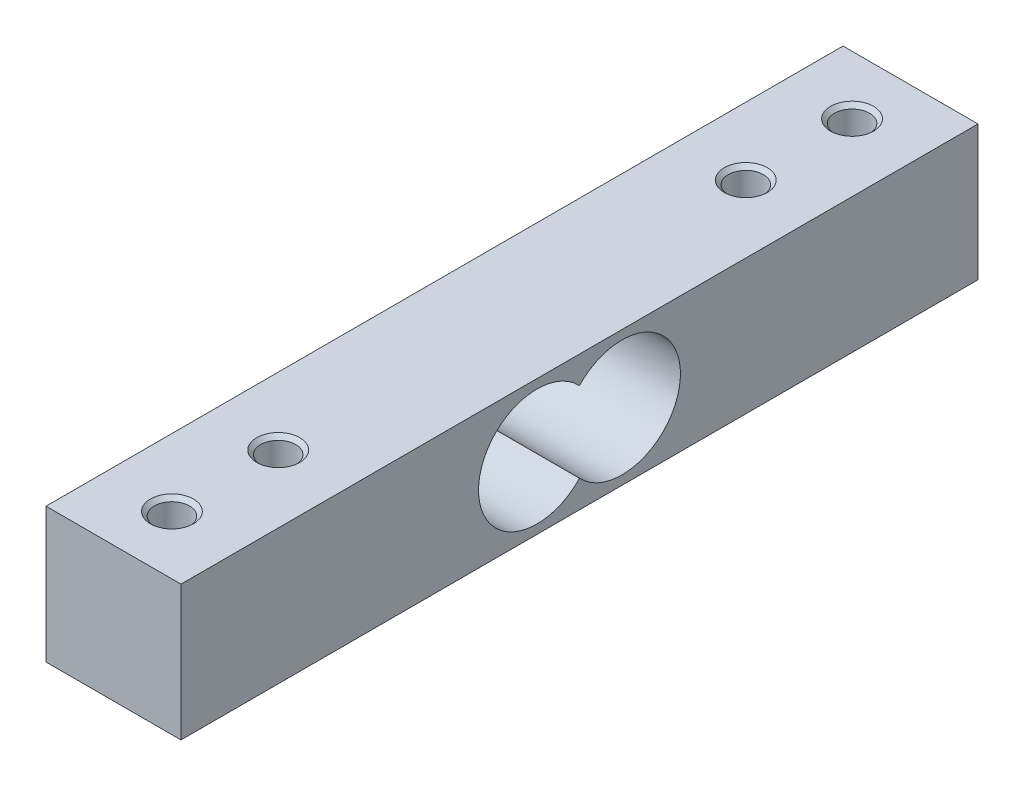
ISO-10303-21;
HEADER;
FILE_DESCRIPTION(('STEP AP214'),'2;1');
FILE_NAME('part.step','',(''),(''),'','','');
FILE_SCHEMA(('AUTOMOTIVE_DESIGN { 1 0 10303 214 1 1 1 1 }'));
ENDSEC;
DATA;
#1=APPLICATION_CONTEXT('core data for automotive mechanical design processes');
#2=APPLICATION_PROTOCOL_DEFINITION('international standard','automotive_design',2000,#1);
#3=PRODUCT_CONTEXT('',#1,'mechanical');
#4=PRODUCT('Part','Part','',(#3));
#5=PRODUCT_RELATED_PRODUCT_CATEGORY('part','',(#4));
#6=PRODUCT_DEFINITION_FORMATION('','',#4);
#7=PRODUCT_DEFINITION_CONTEXT('part definition',#1,'design');
#8=PRODUCT_DEFINITION('design','',#6,#7);
#9=PRODUCT_DEFINITION_SHAPE('','',#8);
#10=(LENGTH_UNIT() NAMED_UNIT(*) SI_UNIT(.MILLI.,.METRE.));
#11=(NAMED_UNIT(*) PLANE_ANGLE_UNIT() SI_UNIT($,.RADIAN.));
#12=(NAMED_UNIT(*) SI_UNIT($,.STERADIAN.) SOLID_ANGLE_UNIT());
#13=UNCERTAINTY_MEASURE_WITH_UNIT(LENGTH_MEASURE(1.E-05),#10,'distance_accuracy_value','');
#14=(GEOMETRIC_REPRESENTATION_CONTEXT(3) GLOBAL_UNCERTAINTY_ASSIGNED_CONTEXT((#13)) GLOBAL_UNIT_ASSIGNED_CONTEXT((#10,
#11,#12)) REPRESENTATION_CONTEXT('',''));
#15=CARTESIAN_POINT('',(0.,0.,0.));
#16=DIRECTION('',(0.,0.,1.));
#17=DIRECTION('',(1.,0.,0.));
#18=AXIS2_PLACEMENT_3D('',#15,#16,#17);
#19=CARTESIAN_POINT('',(6.35,6.35,-75.));
#20=DIRECTION('',(1.,0.,0.));
#21=DIRECTION('',(0.,1.,0.));
#22=AXIS2_PLACEMENT_3D('',#19,#20,#21);
#23=PLANE('',#22);
#24=CARTESIAN_POINT('',(6.35,0.,-33.5));
#25=DIRECTION('',(1.,0.,0.));
#26=DIRECTION('',(0.,-1.,0.));
#27=AXIS2_PLACEMENT_3D('',#24,#25,#26);
#28=CIRCLE('',#27,5.5);
#29=CARTESIAN_POINT('',(6.35,3.77491721763537,-37.5));
#30=VERTEX_POINT('',#29);
#31=CARTESIAN_POINT('',(6.35,-3.77491721763537,-37.5));
#32=VERTEX_POINT('',#31);
#33=EDGE_CURVE('E60',#30,#32,#28,.T.);
#34=ORIENTED_EDGE('',*,*,#33,.F.);
#35=CARTESIAN_POINT('',(6.35,0.,-41.5));
#36=DIRECTION('',(1.,0.,0.));
#37=DIRECTION('',(0.,1.,0.));
#38=AXIS2_PLACEMENT_3D('',#35,#36,#37);
#39=CIRCLE('',#38,5.5);
#40=EDGE_CURVE('E111',#32,#30,#39,.T.);
#41=ORIENTED_EDGE('',*,*,#40,.F.);
#42=EDGE_LOOP('',(#34,#41));
#43=FACE_BOUND('',#42,.T.);
#44=DIRECTION('',(0.,1.,0.));
#45=VECTOR('',#44,1.);
#46=CARTESIAN_POINT('',(6.35,6.35,0.));
#47=LINE('',#46,#45);
#48=CARTESIAN_POINT('',(6.35,-6.35,0.));
#49=VERTEX_POINT('',#48);
#50=CARTESIAN_POINT('',(6.35,6.35,0.));
#51=VERTEX_POINT('',#50);
#52=EDGE_CURVE('E122',#49,#51,#47,.T.);
#53=ORIENTED_EDGE('',*,*,#52,.F.);
#54=DIRECTION('',(0.,0.,1.));
#55=VECTOR('',#54,1.);
#56=CARTESIAN_POINT('',(6.35,-6.35,-75.));
#57=LINE('',#56,#55);
#58=CARTESIAN_POINT('',(6.35,-6.35,-75.));
#59=VERTEX_POINT('',#58);
#60=EDGE_CURVE('E11',#59,#49,#57,.T.);
#61=ORIENTED_EDGE('',*,*,#60,.F.);
#62=DIRECTION('',(0.,1.,0.));
#63=VECTOR('',#62,1.);
#64=CARTESIAN_POINT('',(6.35,6.35,-75.));
#65=LINE('',#64,#63);
#66=CARTESIAN_POINT('',(6.35,6.35,-75.));
#67=VERTEX_POINT('',#66);
#68=EDGE_CURVE('E124',#59,#67,#65,.T.);
#69=ORIENTED_EDGE('',*,*,#68,.T.);
#70=DIRECTION('',(0.,0.,1.));
#71=VECTOR('',#70,1.);
#72=CARTESIAN_POINT('',(6.35,6.35,-75.));
#73=LINE('',#72,#71);
#74=EDGE_CURVE('E46',#67,#51,#73,.T.);
#75=ORIENTED_EDGE('',*,*,#74,.T.);
#76=EDGE_LOOP('',(#53,#61,#69,#75));
#77=FACE_BOUND('',#76,.T.);
#78=ADVANCED_FACE('F43',(#43,#77),#23,.T.);
#79=CARTESIAN_POINT('',(-6.35,-6.35,-75.));
#80=DIRECTION('',(0.,-1.,0.));
#81=DIRECTION('',(0.,0.,-1.));
#82=AXIS2_PLACEMENT_3D('',#79,#80,#81);
#83=PLANE('',#82);
#84=CARTESIAN_POINT('',(0.,-6.35,-5.5));
#85=DIRECTION('',(0.,1.,0.));
#86=DIRECTION('',(0.,0.,1.));
#87=AXIS2_PLACEMENT_3D('',#84,#85,#86);
#88=CIRCLE('',#87,1.65);
#89=CARTESIAN_POINT('',(0.,-6.35,-3.85));
#90=VERTEX_POINT('',#89);
#91=EDGE_CURVE('E353',#90,#90,#88,.T.);
#92=ORIENTED_EDGE('',*,*,#91,.T.);
#93=EDGE_LOOP('',(#92));
#94=FACE_BOUND('',#93,.T.);
#95=CARTESIAN_POINT('',(0.,-6.35,-15.5));
#96=DIRECTION('',(0.,1.,0.));
#97=DIRECTION('',(0.,0.,1.));
#98=AXIS2_PLACEMENT_3D('',#95,#96,#97);
#99=CIRCLE('',#98,1.65);
#100=CARTESIAN_POINT('',(0.,-6.35,-13.85));
#101=VERTEX_POINT('',#100);
#102=EDGE_CURVE('E367',#101,#101,#99,.T.);
#103=ORIENTED_EDGE('',*,*,#102,.T.);
#104=EDGE_LOOP('',(#103));
#105=FACE_BOUND('',#104,.T.);
#106=CARTESIAN_POINT('',(0.,-6.35,-59.5));
#107=DIRECTION('',(0.,1.,0.));
#108=DIRECTION('',(0.,0.,1.));
#109=AXIS2_PLACEMENT_3D('',#106,#107,#108);
#110=CIRCLE('',#109,1.65);
#111=CARTESIAN_POINT('',(0.,-6.35,-57.85));
#112=VERTEX_POINT('',#111);
#113=EDGE_CURVE('E379',#112,#112,#110,.T.);
#114=ORIENTED_EDGE('',*,*,#113,.T.);
#115=EDGE_LOOP('',(#114));
#116=FACE_BOUND('',#115,.T.);
#117=CARTESIAN_POINT('',(0.,-6.35,-69.5));
#118=DIRECTION('',(0.,1.,0.));
#119=DIRECTION('',(0.,0.,1.));
#120=AXIS2_PLACEMENT_3D('',#117,#118,#119);
#121=CIRCLE('',#120,1.65);
#122=CARTESIAN_POINT('',(0.,-6.35,-67.85));
#123=VERTEX_POINT('',#122);
#124=EDGE_CURVE('E116',#123,#123,#121,.T.);
#125=ORIENTED_EDGE('',*,*,#124,.T.);
#126=EDGE_LOOP('',(#125));
#127=FACE_BOUND('',#126,.T.);
#128=DIRECTION('',(1.,0.,0.));
#129=VECTOR('',#128,1.);
#130=CARTESIAN_POINT('',(-6.35,-6.35,0.));
#131=LINE('',#130,#129);
#132=CARTESIAN_POINT('',(-6.35,-6.35,0.));
#133=VERTEX_POINT('',#132);
#134=EDGE_CURVE('E129',#133,#49,#131,.T.);
#135=ORIENTED_EDGE('',*,*,#134,.F.);
#136=DIRECTION('',(0.,0.,1.));
#137=VECTOR('',#136,1.);
#138=CARTESIAN_POINT('',(-6.35,-6.35,-75.));
#139=LINE('',#138,#137);
#140=CARTESIAN_POINT('',(-6.35,-6.35,-75.));
#141=VERTEX_POINT('',#140);
#142=EDGE_CURVE('E52',#141,#133,#139,.T.);
#143=ORIENTED_EDGE('',*,*,#142,.F.);
#144=DIRECTION('',(1.,0.,0.));
#145=VECTOR('',#144,1.);
#146=CARTESIAN_POINT('',(-6.35,-6.35,-75.));
#147=LINE('',#146,#145);
#148=EDGE_CURVE('E137',#141,#59,#147,.T.);
#149=ORIENTED_EDGE('',*,*,#148,.T.);
#150=ORIENTED_EDGE('',*,*,#60,.T.);
#151=EDGE_LOOP('',(#135,#143,#149,#150));
#152=FACE_BOUND('',#151,.T.);
#153=ADVANCED_FACE('F171',(#94,#105,#116,#127,#152),#83,.T.);
#154=CARTESIAN_POINT('',(-6.35,6.35,-75.));
#155=DIRECTION('',(-1.,0.,0.));
#156=DIRECTION('',(0.,-1.,0.));
#157=AXIS2_PLACEMENT_3D('',#154,#155,#156);
#158=PLANE('',#157);
#159=CARTESIAN_POINT('',(-6.35,0.,-33.5));
#160=DIRECTION('',(1.,0.,0.));
#161=DIRECTION('',(0.,-1.,0.));
#162=AXIS2_PLACEMENT_3D('',#159,#160,#161);
#163=CIRCLE('',#162,5.5);
#164=CARTESIAN_POINT('',(-6.35,3.77491721763537,-37.5));
#165=VERTEX_POINT('',#164);
#166=CARTESIAN_POINT('',(-6.35,-3.77491721763537,-37.5));
#167=VERTEX_POINT('',#166);
#168=EDGE_CURVE('E65',#165,#167,#163,.T.);
#169=ORIENTED_EDGE('',*,*,#168,.T.);
#170=CARTESIAN_POINT('',(-6.35,0.,-41.5));
#171=DIRECTION('',(1.,0.,0.));
#172=DIRECTION('',(0.,1.,0.));
#173=AXIS2_PLACEMENT_3D('',#170,#171,#172);
#174=CIRCLE('',#173,5.5);
#175=EDGE_CURVE('E101',#167,#165,#174,.T.);
#176=ORIENTED_EDGE('',*,*,#175,.T.);
#177=EDGE_LOOP('',(#169,#176));
#178=FACE_BOUND('',#177,.T.);
#179=DIRECTION('',(0.,-1.,0.));
#180=VECTOR('',#179,1.);
#181=CARTESIAN_POINT('',(-6.35,6.35,0.));
#182=LINE('',#181,#180);
#183=CARTESIAN_POINT('',(-6.35,6.35,0.));
#184=VERTEX_POINT('',#183);
#185=EDGE_CURVE('E148',#184,#133,#182,.T.);
#186=ORIENTED_EDGE('',*,*,#185,.F.);
#187=DIRECTION('',(0.,0.,1.));
#188=VECTOR('',#187,1.);
#189=CARTESIAN_POINT('',(-6.35,6.35,-75.));
#190=LINE('',#189,#188);
#191=CARTESIAN_POINT('',(-6.35,6.35,-75.));
#192=VERTEX_POINT('',#191);
#193=EDGE_CURVE('E156',#192,#184,#190,.T.);
#194=ORIENTED_EDGE('',*,*,#193,.F.);
#195=DIRECTION('',(0.,-1.,0.));
#196=VECTOR('',#195,1.);
#197=CARTESIAN_POINT('',(-6.35,6.35,-75.));
#198=LINE('',#197,#196);
#199=EDGE_CURVE('E133',#192,#141,#198,.T.);
#200=ORIENTED_EDGE('',*,*,#199,.T.);
#201=ORIENTED_EDGE('',*,*,#142,.T.);
#202=EDGE_LOOP('',(#186,#194,#200,#201));
#203=FACE_BOUND('',#202,.T.);
#204=ADVANCED_FACE('F108',(#178,#203),#158,.T.);
#205=CARTESIAN_POINT('',(-6.35,6.35,-75.));
#206=DIRECTION('',(0.,1.,0.));
#207=DIRECTION('',(0.,0.,1.));
#208=AXIS2_PLACEMENT_3D('',#205,#206,#207);
#209=PLANE('',#208);
#210=CARTESIAN_POINT('',(0.,6.35,-5.5));
#211=DIRECTION('',(0.,1.,0.));
#212=DIRECTION('',(0.,0.,1.));
#213=AXIS2_PLACEMENT_3D('',#210,#211,#212);
#214=CIRCLE('',#213,2.025);
#215=CARTESIAN_POINT('',(0.,6.35,-3.475));
#216=VERTEX_POINT('',#215);
#217=EDGE_CURVE('E349',#216,#216,#214,.T.);
#218=ORIENTED_EDGE('',*,*,#217,.F.);
#219=EDGE_LOOP('',(#218));
#220=FACE_BOUND('',#219,.T.);
#221=CARTESIAN_POINT('',(0.,6.35,-15.5));
#222=DIRECTION('',(0.,1.,0.));
#223=DIRECTION('',(0.,0.,1.));
#224=AXIS2_PLACEMENT_3D('',#221,#222,#223);
#225=CIRCLE('',#224,2.025);
#226=CARTESIAN_POINT('',(0.,6.35,-13.475));
#227=VERTEX_POINT('',#226);
#228=EDGE_CURVE('E359',#227,#227,#225,.T.);
#229=ORIENTED_EDGE('',*,*,#228,.F.);
#230=EDGE_LOOP('',(#229));
#231=FACE_BOUND('',#230,.T.);
#232=CARTESIAN_POINT('',(0.,6.35,-59.5));
#233=DIRECTION('',(0.,1.,0.));
#234=DIRECTION('',(0.,0.,1.));
#235=AXIS2_PLACEMENT_3D('',#232,#233,#234);
#236=CIRCLE('',#235,2.025);
#237=CARTESIAN_POINT('',(0.,6.35,-57.475));
#238=VERTEX_POINT('',#237);
#239=EDGE_CURVE('E371',#238,#238,#236,.T.);
#240=ORIENTED_EDGE('',*,*,#239,.F.);
#241=EDGE_LOOP('',(#240));
#242=FACE_BOUND('',#241,.T.);
#243=CARTESIAN_POINT('',(0.,6.35,-69.5));
#244=DIRECTION('',(0.,1.,0.));
#245=DIRECTION('',(0.,0.,1.));
#246=AXIS2_PLACEMENT_3D('',#243,#244,#245);
#247=CIRCLE('',#246,2.025);
#248=CARTESIAN_POINT('',(0.,6.35,-67.475));
#249=VERTEX_POINT('',#248);
#250=EDGE_CURVE('E383',#249,#249,#247,.T.);
#251=ORIENTED_EDGE('',*,*,#250,.F.);
#252=EDGE_LOOP('',(#251));
#253=FACE_BOUND('',#252,.T.);
#254=DIRECTION('',(-1.,0.,0.));
#255=VECTOR('',#254,1.);
#256=CARTESIAN_POINT('',(-6.35,6.35,0.));
#257=LINE('',#256,#255);
#258=EDGE_CURVE('E144',#51,#184,#257,.T.);
#259=ORIENTED_EDGE('',*,*,#258,.F.);
#260=ORIENTED_EDGE('',*,*,#74,.F.);
#261=DIRECTION('',(-1.,0.,0.));
#262=VECTOR('',#261,1.);
#263=CARTESIAN_POINT('',(-6.35,6.35,-75.));
#264=LINE('',#263,#262);
#265=EDGE_CURVE('E128',#67,#192,#264,.T.);
#266=ORIENTED_EDGE('',*,*,#265,.T.);
#267=ORIENTED_EDGE('',*,*,#193,.T.);
#268=EDGE_LOOP('',(#259,#260,#266,#267));
#269=FACE_BOUND('',#268,.T.);
#270=ADVANCED_FACE('F166',(#220,#231,#242,#253,#269),#209,.T.);
#271=CARTESIAN_POINT('',(0.,0.,-75.));
#272=DIRECTION('',(0.,0.,1.));
#273=DIRECTION('',(1.,0.,0.));
#274=AXIS2_PLACEMENT_3D('',#271,#272,#273);
#275=PLANE('',#274);
#276=ORIENTED_EDGE('',*,*,#68,.F.);
#277=ORIENTED_EDGE('',*,*,#148,.F.);
#278=ORIENTED_EDGE('',*,*,#199,.F.);
#279=ORIENTED_EDGE('',*,*,#265,.F.);
#280=EDGE_LOOP('',(#276,#277,#278,#279));
#281=FACE_BOUND('',#280,.T.);
#282=ADVANCED_FACE('F174',(#281),#275,.F.);
#283=CARTESIAN_POINT('',(0.,0.,0.));
#284=DIRECTION('',(0.,0.,1.));
#285=DIRECTION('',(1.,0.,0.));
#286=AXIS2_PLACEMENT_3D('',#283,#284,#285);
#287=PLANE('',#286);
#288=ORIENTED_EDGE('',*,*,#52,.T.);
#289=ORIENTED_EDGE('',*,*,#258,.T.);
#290=ORIENTED_EDGE('',*,*,#185,.T.);
#291=ORIENTED_EDGE('',*,*,#134,.T.);
#292=EDGE_LOOP('',(#288,#289,#290,#291));
#293=FACE_BOUND('',#292,.T.);
#294=ADVANCED_FACE('F168',(#293),#287,.T.);
#295=CARTESIAN_POINT('',(-6.35,0.,-33.5));
#296=DIRECTION('',(1.,0.,0.));
#297=DIRECTION('',(0.,1.,0.));
#298=AXIS2_PLACEMENT_3D('',#295,#296,#297);
#299=CYLINDRICAL_SURFACE('',#298,5.5);
#300=ORIENTED_EDGE('',*,*,#33,.T.);
#301=DIRECTION('',(1.,0.,0.));
#302=VECTOR('',#301,1.);
#303=CARTESIAN_POINT('',(-6.35,-3.77491721763537,-37.5));
#304=LINE('',#303,#302);
#305=EDGE_CURVE('E93',#167,#32,#304,.T.);
#306=ORIENTED_EDGE('',*,*,#305,.F.);
#307=ORIENTED_EDGE('',*,*,#168,.F.);
#308=DIRECTION('',(1.,0.,0.));
#309=VECTOR('',#308,1.);
#310=CARTESIAN_POINT('',(-6.35,3.77491721763537,-37.5));
#311=LINE('',#310,#309);
#312=EDGE_CURVE('E100',#165,#30,#311,.T.);
#313=ORIENTED_EDGE('',*,*,#312,.T.);
#314=EDGE_LOOP('',(#300,#306,#307,#313));
#315=FACE_BOUND('',#314,.T.);
#316=ADVANCED_FACE('F95',(#315),#299,.F.);
#317=CARTESIAN_POINT('',(-6.35,0.,-41.5));
#318=DIRECTION('',(1.,0.,0.));
#319=DIRECTION('',(0.,1.,0.));
#320=AXIS2_PLACEMENT_3D('',#317,#318,#319);
#321=CYLINDRICAL_SURFACE('',#320,5.5);
#322=ORIENTED_EDGE('',*,*,#40,.T.);
#323=ORIENTED_EDGE('',*,*,#312,.F.);
#324=ORIENTED_EDGE('',*,*,#175,.F.);
#325=ORIENTED_EDGE('',*,*,#305,.T.);
#326=EDGE_LOOP('',(#322,#323,#324,#325));
#327=FACE_BOUND('',#326,.T.);
#328=ADVANCED_FACE('F104',(#327),#321,.F.);
#329=CARTESIAN_POINT('',(0.,6.35,-69.5));
#330=DIRECTION('',(0.,1.,0.));
#331=DIRECTION('',(0.,0.,1.));
#332=AXIS2_PLACEMENT_3D('',#329,#330,#331);
#333=CYLINDRICAL_SURFACE('',#332,1.65);
#334=ORIENTED_EDGE('',*,*,#124,.F.);
#335=EDGE_LOOP('',(#334));
#336=FACE_BOUND('',#335,.T.);
#337=CARTESIAN_POINT('',(0.,5.975,-69.5));
#338=DIRECTION('',(0.,1.,0.));
#339=DIRECTION('',(0.,0.,1.));
#340=AXIS2_PLACEMENT_3D('',#337,#338,#339);
#341=CIRCLE('',#340,1.65);
#342=CARTESIAN_POINT('',(0.,5.975,-67.85));
#343=VERTEX_POINT('',#342);
#344=EDGE_CURVE('E386',#343,#343,#341,.T.);
#345=ORIENTED_EDGE('',*,*,#344,.T.);
#346=EDGE_LOOP('',(#345));
#347=FACE_BOUND('',#346,.T.);
#348=ADVANCED_FACE('F213',(#336,#347),#333,.F.);
#349=CARTESIAN_POINT('',(0.,6.35,-69.5));
#350=DIRECTION('',(0.,1.,0.));
#351=DIRECTION('',(0.,0.,1.));
#352=AXIS2_PLACEMENT_3D('',#349,#350,#351);
#353=CONICAL_SURFACE('',#352,2.025,0.78539816339745);
#354=ORIENTED_EDGE('',*,*,#344,.F.);
#355=EDGE_LOOP('',(#354));
#356=FACE_BOUND('',#355,.T.);
#357=ORIENTED_EDGE('',*,*,#250,.T.);
#358=EDGE_LOOP('',(#357));
#359=FACE_BOUND('',#358,.T.);
#360=ADVANCED_FACE('F219',(#356,#359),#353,.F.);
#361=CARTESIAN_POINT('',(0.,6.35,-59.5));
#362=DIRECTION('',(0.,1.,0.));
#363=DIRECTION('',(0.,0.,1.));
#364=AXIS2_PLACEMENT_3D('',#361,#362,#363);
#365=CYLINDRICAL_SURFACE('',#364,1.65);
#366=ORIENTED_EDGE('',*,*,#113,.F.);
#367=EDGE_LOOP('',(#366));
#368=FACE_BOUND('',#367,.T.);
#369=CARTESIAN_POINT('',(0.,5.975,-59.5));
#370=DIRECTION('',(0.,1.,0.));
#371=DIRECTION('',(0.,0.,1.));
#372=AXIS2_PLACEMENT_3D('',#369,#370,#371);
#373=CIRCLE('',#372,1.65);
#374=CARTESIAN_POINT('',(0.,5.975,-57.85));
#375=VERTEX_POINT('',#374);
#376=EDGE_CURVE('E375',#375,#375,#373,.T.);
#377=ORIENTED_EDGE('',*,*,#376,.T.);
#378=EDGE_LOOP('',(#377));
#379=FACE_BOUND('',#378,.T.);
#380=ADVANCED_FACE('F232',(#368,#379),#365,.F.);
#381=CARTESIAN_POINT('',(0.,6.35,-59.5));
#382=DIRECTION('',(0.,1.,0.));
#383=DIRECTION('',(0.,0.,1.));
#384=AXIS2_PLACEMENT_3D('',#381,#382,#383);
#385=CONICAL_SURFACE('',#384,2.025,0.78539816339745);
#386=ORIENTED_EDGE('',*,*,#376,.F.);
#387=EDGE_LOOP('',(#386));
#388=FACE_BOUND('',#387,.T.);
#389=ORIENTED_EDGE('',*,*,#239,.T.);
#390=EDGE_LOOP('',(#389));
#391=FACE_BOUND('',#390,.T.);
#392=ADVANCED_FACE('F243',(#388,#391),#385,.F.);
#393=CARTESIAN_POINT('',(0.,6.35,-15.5));
#394=DIRECTION('',(0.,1.,0.));
#395=DIRECTION('',(0.,0.,1.));
#396=AXIS2_PLACEMENT_3D('',#393,#394,#395);
#397=CYLINDRICAL_SURFACE('',#396,1.65);
#398=ORIENTED_EDGE('',*,*,#102,.F.);
#399=EDGE_LOOP('',(#398));
#400=FACE_BOUND('',#399,.T.);
#401=CARTESIAN_POINT('',(0.,5.975,-15.5));
#402=DIRECTION('',(0.,1.,0.));
#403=DIRECTION('',(0.,0.,1.));
#404=AXIS2_PLACEMENT_3D('',#401,#402,#403);
#405=CIRCLE('',#404,1.65);
#406=CARTESIAN_POINT('',(0.,5.975,-13.85));
#407=VERTEX_POINT('',#406);
#408=EDGE_CURVE('E363',#407,#407,#405,.T.);
#409=ORIENTED_EDGE('',*,*,#408,.T.);
#410=EDGE_LOOP('',(#409));
#411=FACE_BOUND('',#410,.T.);
#412=ADVANCED_FACE('F255',(#400,#411),#397,.F.);
#413=CARTESIAN_POINT('',(0.,6.35,-15.5));
#414=DIRECTION('',(0.,1.,0.));
#415=DIRECTION('',(0.,0.,1.));
#416=AXIS2_PLACEMENT_3D('',#413,#414,#415);
#417=CONICAL_SURFACE('',#416,2.025,0.78539816339745);
#418=ORIENTED_EDGE('',*,*,#408,.F.);
#419=EDGE_LOOP('',(#418));
#420=FACE_BOUND('',#419,.T.);
#421=ORIENTED_EDGE('',*,*,#228,.T.);
#422=EDGE_LOOP('',(#421));
#423=FACE_BOUND('',#422,.T.);
#424=ADVANCED_FACE('F266',(#420,#423),#417,.F.);
#425=CARTESIAN_POINT('',(0.,6.35,-5.5));
#426=DIRECTION('',(0.,1.,0.));
#427=DIRECTION('',(0.,0.,1.));
#428=AXIS2_PLACEMENT_3D('',#425,#426,#427);
#429=CYLINDRICAL_SURFACE('',#428,1.65);
#430=ORIENTED_EDGE('',*,*,#91,.F.);
#431=EDGE_LOOP('',(#430));
#432=FACE_BOUND('',#431,.T.);
#433=CARTESIAN_POINT('',(0.,5.975,-5.5));
#434=DIRECTION('',(0.,1.,0.));
#435=DIRECTION('',(0.,0.,1.));
#436=AXIS2_PLACEMENT_3D('',#433,#434,#435);
#437=CIRCLE('',#436,1.65);
#438=CARTESIAN_POINT('',(0.,5.975,-3.85));
#439=VERTEX_POINT('',#438);
#440=EDGE_CURVE('E346',#439,#439,#437,.T.);
#441=ORIENTED_EDGE('',*,*,#440,.T.);
#442=EDGE_LOOP('',(#441));
#443=FACE_BOUND('',#442,.T.);
#444=ADVANCED_FACE('F278',(#432,#443),#429,.F.);
#445=CARTESIAN_POINT('',(0.,6.35,-5.5));
#446=DIRECTION('',(0.,1.,0.));
#447=DIRECTION('',(0.,0.,1.));
#448=AXIS2_PLACEMENT_3D('',#445,#446,#447);
#449=CONICAL_SURFACE('',#448,2.025,0.78539816339745);
#450=ORIENTED_EDGE('',*,*,#440,.F.);
#451=EDGE_LOOP('',(#450));
#452=FACE_BOUND('',#451,.T.);
#453=ORIENTED_EDGE('',*,*,#217,.T.);
#454=EDGE_LOOP('',(#453));
#455=FACE_BOUND('',#454,.T.);
#456=ADVANCED_FACE('F289',(#452,#455),#449,.F.);
#457=CLOSED_SHELL('',(#78,#153,#204,#270,#282,#294,#316,#328,#348,#360,#380,#392,#412,#424,#444,#456));
#458=MANIFOLD_SOLID_BREP('B2',#457);
#459=ADVANCED_BREP_SHAPE_REPRESENTATION('',(#18,#458),#14);
#460=SHAPE_DEFINITION_REPRESENTATION(#9,#459);
ENDSEC;
END-ISO-10303-21;
